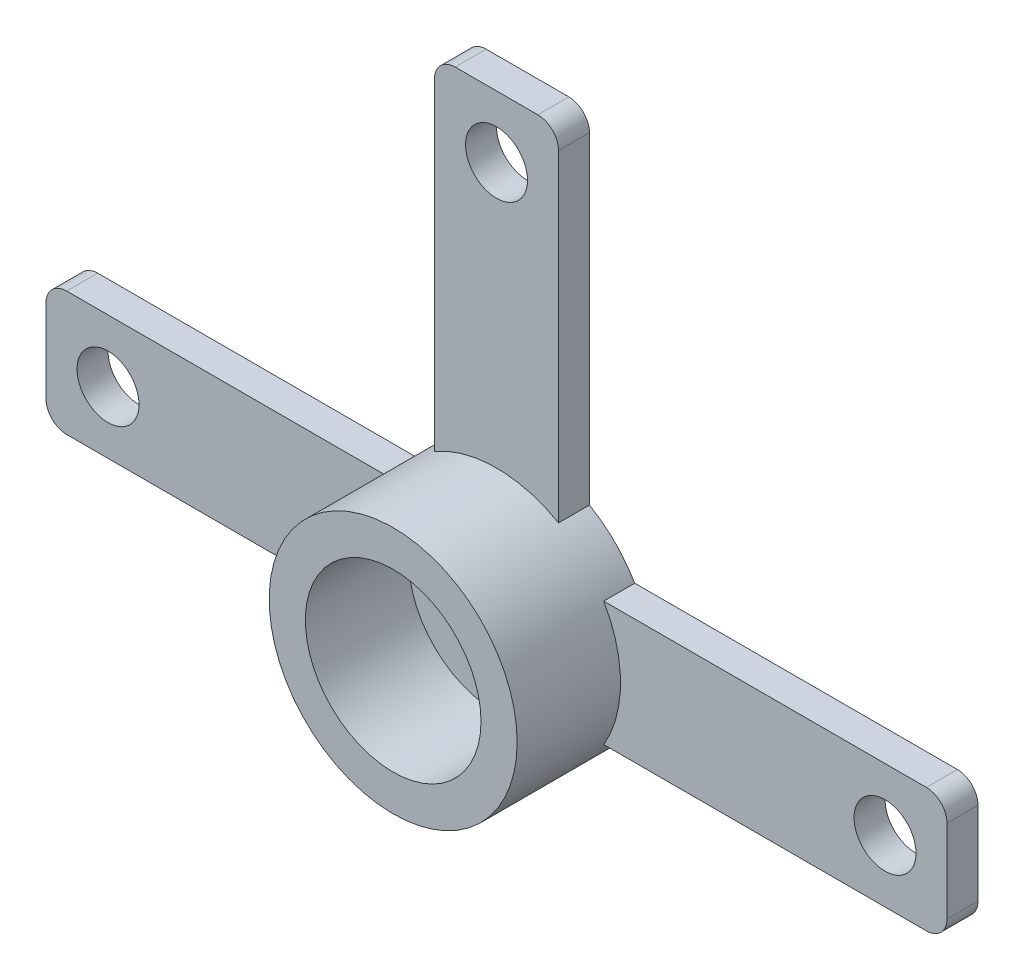
ISO-10303-21;
HEADER;
FILE_DESCRIPTION(('STEP AP214'),'2;1');
FILE_NAME('part.step','',(''),(''),'','','');
FILE_SCHEMA(('AUTOMOTIVE_DESIGN { 1 0 10303 214 1 1 1 1 }'));
ENDSEC;
DATA;
#1=APPLICATION_CONTEXT('core data for automotive mechanical design processes');
#2=APPLICATION_PROTOCOL_DEFINITION('international standard','automotive_design',2000,#1);
#3=PRODUCT_CONTEXT('',#1,'mechanical');
#4=PRODUCT('Part','Part','',(#3));
#5=PRODUCT_RELATED_PRODUCT_CATEGORY('part','',(#4));
#6=PRODUCT_DEFINITION_FORMATION('','',#4);
#7=PRODUCT_DEFINITION_CONTEXT('part definition',#1,'design');
#8=PRODUCT_DEFINITION('design','',#6,#7);
#9=PRODUCT_DEFINITION_SHAPE('','',#8);
#10=(LENGTH_UNIT() NAMED_UNIT(*) SI_UNIT(.MILLI.,.METRE.));
#11=(NAMED_UNIT(*) PLANE_ANGLE_UNIT() SI_UNIT($,.RADIAN.));
#12=(NAMED_UNIT(*) SI_UNIT($,.STERADIAN.) SOLID_ANGLE_UNIT());
#13=UNCERTAINTY_MEASURE_WITH_UNIT(LENGTH_MEASURE(1.E-05),#10,'distance_accuracy_value','');
#14=(GEOMETRIC_REPRESENTATION_CONTEXT(3) GLOBAL_UNCERTAINTY_ASSIGNED_CONTEXT((#13)) GLOBAL_UNIT_ASSIGNED_CONTEXT((#10,
#11,#12)) REPRESENTATION_CONTEXT('',''));
#15=CARTESIAN_POINT('',(0.,0.,0.));
#16=DIRECTION('',(0.,0.,1.));
#17=DIRECTION('',(1.,0.,0.));
#18=AXIS2_PLACEMENT_3D('',#15,#16,#17);
#19=CARTESIAN_POINT('',(0.,-19.,1.5));
#20=DIRECTION('',(0.,0.,1.));
#21=DIRECTION('',(1.,0.,0.));
#22=AXIS2_PLACEMENT_3D('',#19,#20,#21);
#23=PLANE('',#22);
#24=CARTESIAN_POINT('',(0.,-19.,1.5));
#25=DIRECTION('',(0.,0.,1.));
#26=DIRECTION('',(1.,0.,0.));
#27=AXIS2_PLACEMENT_3D('',#24,#25,#26);
#28=CIRCLE('',#27,6.);
#29=CARTESIAN_POINT('',(3.,-13.8038475772934,1.5));
#30=VERTEX_POINT('',#29);
#31=CARTESIAN_POINT('',(-3.,-13.8038475772934,1.5));
#32=VERTEX_POINT('',#31);
#33=EDGE_CURVE('E11',#30,#32,#28,.T.);
#34=ORIENTED_EDGE('',*,*,#33,.F.);
#35=DIRECTION('',(0.,1.,0.));
#36=VECTOR('',#35,1.);
#37=CARTESIAN_POINT('',(3.,1.79999999999996,1.5));
#38=LINE('',#37,#36);
#39=CARTESIAN_POINT('',(3.,1.79999999999996,1.5));
#40=VERTEX_POINT('',#39);
#41=EDGE_CURVE('E332',#30,#40,#38,.T.);
#42=ORIENTED_EDGE('',*,*,#41,.T.);
#43=CARTESIAN_POINT('',(2.,1.79999999999997,1.5));
#44=DIRECTION('',(0.,0.,1.));
#45=DIRECTION('',(1.,0.,0.));
#46=AXIS2_PLACEMENT_3D('',#43,#44,#45);
#47=CIRCLE('',#46,1.);
#48=CARTESIAN_POINT('',(1.99999999999999,2.79999999999997,1.5));
#49=VERTEX_POINT('',#48);
#50=EDGE_CURVE('E181',#40,#49,#47,.T.);
#51=ORIENTED_EDGE('',*,*,#50,.T.);
#52=DIRECTION('',(-1.,0.,0.));
#53=VECTOR('',#52,1.);
#54=CARTESIAN_POINT('',(1.99999999999999,2.79999999999997,1.5));
#55=LINE('',#54,#53);
#56=CARTESIAN_POINT('',(-1.99999999999999,2.79999999999997,1.5));
#57=VERTEX_POINT('',#56);
#58=EDGE_CURVE('E175',#49,#57,#55,.T.);
#59=ORIENTED_EDGE('',*,*,#58,.T.);
#60=CARTESIAN_POINT('',(-2.,1.79999999999997,1.5));
#61=DIRECTION('',(0.,0.,1.));
#62=DIRECTION('',(-1.,0.,0.));
#63=AXIS2_PLACEMENT_3D('',#60,#61,#62);
#64=CIRCLE('',#63,1.);
#65=CARTESIAN_POINT('',(-3.,1.79999999999996,1.5));
#66=VERTEX_POINT('',#65);
#67=EDGE_CURVE('E179',#57,#66,#64,.T.);
#68=ORIENTED_EDGE('',*,*,#67,.T.);
#69=DIRECTION('',(0.,-1.,0.));
#70=VECTOR('',#69,1.);
#71=CARTESIAN_POINT('',(-3.,1.79999999999996,1.5));
#72=LINE('',#71,#70);
#73=EDGE_CURVE('E61',#66,#32,#72,.T.);
#74=ORIENTED_EDGE('',*,*,#73,.T.);
#75=EDGE_LOOP('',(#34,#42,#51,#59,#68,#74));
#76=FACE_BOUND('',#75,.T.);
#77=CARTESIAN_POINT('',(0.,-0.20000000000003,1.5));
#78=DIRECTION('',(0.,0.,1.));
#79=DIRECTION('',(1.,0.,0.));
#80=AXIS2_PLACEMENT_3D('',#77,#78,#79);
#81=CIRCLE('',#80,1.5);
#82=CARTESIAN_POINT('',(1.5,-0.20000000000003,1.5));
#83=VERTEX_POINT('',#82);
#84=EDGE_CURVE('E289',#83,#83,#81,.T.);
#85=ORIENTED_EDGE('',*,*,#84,.F.);
#86=EDGE_LOOP('',(#85));
#87=FACE_BOUND('',#86,.T.);
#88=ADVANCED_FACE('F41',(#76,#87),#23,.T.);
#89=CARTESIAN_POINT('',(-5.18842774847861,-15.9866600757935,1.5));
#90=VERTEX_POINT('',#89);
#91=CARTESIAN_POINT('',(-5.19615242270666,-22.,1.5));
#92=VERTEX_POINT('',#91);
#93=EDGE_CURVE('E51',#90,#92,#28,.T.);
#94=ORIENTED_EDGE('',*,*,#93,.F.);
#95=DIRECTION('',(-1.,0.,0.));
#96=VECTOR('',#95,1.);
#97=CARTESIAN_POINT('',(-5.18842774847861,-15.9866600757935,1.5));
#98=LINE('',#97,#96);
#99=CARTESIAN_POINT('',(-20.8,-15.9866600757935,1.5));
#100=VERTEX_POINT('',#99);
#101=EDGE_CURVE('E234',#90,#100,#98,.T.);
#102=ORIENTED_EDGE('',*,*,#101,.T.);
#103=CARTESIAN_POINT('',(-20.8,-16.9866600757935,1.5));
#104=DIRECTION('',(0.,0.,1.));
#105=DIRECTION('',(1.,0.,0.));
#106=AXIS2_PLACEMENT_3D('',#103,#104,#105);
#107=CIRCLE('',#106,1.);
#108=CARTESIAN_POINT('',(-21.8,-16.9866600757935,1.5));
#109=VERTEX_POINT('',#108);
#110=EDGE_CURVE('E313',#100,#109,#107,.T.);
#111=ORIENTED_EDGE('',*,*,#110,.T.);
#112=DIRECTION('',(0.,-1.,0.));
#113=VECTOR('',#112,1.);
#114=CARTESIAN_POINT('',(-21.8,-16.9866600757935,1.5));
#115=LINE('',#114,#113);
#116=CARTESIAN_POINT('',(-21.8,-21.,1.5));
#117=VERTEX_POINT('',#116);
#118=EDGE_CURVE('E315',#109,#117,#115,.T.);
#119=ORIENTED_EDGE('',*,*,#118,.T.);
#120=CARTESIAN_POINT('',(-20.8,-21.,1.5));
#121=DIRECTION('',(0.,0.,1.));
#122=DIRECTION('',(1.,0.,0.));
#123=AXIS2_PLACEMENT_3D('',#120,#121,#122);
#124=CIRCLE('',#123,1.);
#125=CARTESIAN_POINT('',(-20.8,-22.,1.5));
#126=VERTEX_POINT('',#125);
#127=EDGE_CURVE('E317',#117,#126,#124,.T.);
#128=ORIENTED_EDGE('',*,*,#127,.T.);
#129=DIRECTION('',(1.,0.,0.));
#130=VECTOR('',#129,1.);
#131=CARTESIAN_POINT('',(-20.8,-22.,1.5));
#132=LINE('',#131,#130);
#133=EDGE_CURVE('E319',#126,#92,#132,.T.);
#134=ORIENTED_EDGE('',*,*,#133,.T.);
#135=EDGE_LOOP('',(#94,#102,#111,#119,#128,#134));
#136=FACE_BOUND('',#135,.T.);
#137=CARTESIAN_POINT('',(-18.8,-18.9999999999988,1.5));
#138=DIRECTION('',(0.,0.,1.));
#139=DIRECTION('',(1.,0.,0.));
#140=AXIS2_PLACEMENT_3D('',#137,#138,#139);
#141=CIRCLE('',#140,1.5);
#142=CARTESIAN_POINT('',(-17.3,-18.9999999999988,1.5));
#143=VERTEX_POINT('',#142);
#144=EDGE_CURVE('E302',#143,#143,#141,.T.);
#145=ORIENTED_EDGE('',*,*,#144,.F.);
#146=EDGE_LOOP('',(#145));
#147=FACE_BOUND('',#146,.T.);
#148=ADVANCED_FACE('F364',(#136,#147),#23,.T.);
#149=CARTESIAN_POINT('',(0.,-19.,1.5));
#150=DIRECTION('',(0.,0.,1.));
#151=DIRECTION('',(1.,0.,0.));
#152=AXIS2_PLACEMENT_3D('',#149,#150,#151);
#153=CIRCLE('',#152,2.66);
#154=CARTESIAN_POINT('',(2.66,-19.,1.5));
#155=VERTEX_POINT('',#154);
#156=EDGE_CURVE('E203',#155,#155,#153,.T.);
#157=ORIENTED_EDGE('',*,*,#156,.F.);
#158=EDGE_LOOP('',(#157));
#159=FACE_BOUND('',#158,.T.);
#160=CARTESIAN_POINT('',(0.,-19.,1.5));
#161=DIRECTION('',(0.,0.,1.));
#162=DIRECTION('',(1.,0.,0.));
#163=AXIS2_PLACEMENT_3D('',#160,#161,#162);
#164=CIRCLE('',#163,4.25);
#165=CARTESIAN_POINT('',(4.25,-19.,1.5));
#166=VERTEX_POINT('',#165);
#167=EDGE_CURVE('E481',#166,#166,#164,.T.);
#168=ORIENTED_EDGE('',*,*,#167,.T.);
#169=EDGE_LOOP('',(#168));
#170=FACE_BOUND('',#169,.T.);
#171=ADVANCED_FACE('F371',(#159,#170),#23,.T.);
#172=CARTESIAN_POINT('',(5.19615242270666,-22.,1.5));
#173=VERTEX_POINT('',#172);
#174=CARTESIAN_POINT('',(5.18842774847861,-15.9866600757935,1.5));
#175=VERTEX_POINT('',#174);
#176=EDGE_CURVE('E53',#173,#175,#28,.T.);
#177=ORIENTED_EDGE('',*,*,#176,.F.);
#178=DIRECTION('',(1.,0.,0.));
#179=VECTOR('',#178,1.);
#180=CARTESIAN_POINT('',(20.8,-22.,1.5));
#181=LINE('',#180,#179);
#182=CARTESIAN_POINT('',(20.8,-22.,1.5));
#183=VERTEX_POINT('',#182);
#184=EDGE_CURVE('E321',#173,#183,#181,.T.);
#185=ORIENTED_EDGE('',*,*,#184,.T.);
#186=CARTESIAN_POINT('',(20.8,-21.,1.5));
#187=DIRECTION('',(0.,0.,1.));
#188=DIRECTION('',(-1.,0.,0.));
#189=AXIS2_PLACEMENT_3D('',#186,#187,#188);
#190=CIRCLE('',#189,1.);
#191=CARTESIAN_POINT('',(21.8,-21.,1.5));
#192=VERTEX_POINT('',#191);
#193=EDGE_CURVE('E323',#183,#192,#190,.T.);
#194=ORIENTED_EDGE('',*,*,#193,.T.);
#195=DIRECTION('',(0.,1.,0.));
#196=VECTOR('',#195,1.);
#197=CARTESIAN_POINT('',(21.8,-16.9866600757935,1.5));
#198=LINE('',#197,#196);
#199=CARTESIAN_POINT('',(21.8,-16.9866600757935,1.5));
#200=VERTEX_POINT('',#199);
#201=EDGE_CURVE('E325',#192,#200,#198,.T.);
#202=ORIENTED_EDGE('',*,*,#201,.T.);
#203=CARTESIAN_POINT('',(20.8,-16.9866600757935,1.5));
#204=DIRECTION('',(0.,0.,1.));
#205=DIRECTION('',(1.,0.,0.));
#206=AXIS2_PLACEMENT_3D('',#203,#204,#205);
#207=CIRCLE('',#206,1.);
#208=CARTESIAN_POINT('',(20.8,-15.9866600757935,1.5));
#209=VERTEX_POINT('',#208);
#210=EDGE_CURVE('E327',#200,#209,#207,.T.);
#211=ORIENTED_EDGE('',*,*,#210,.T.);
#212=DIRECTION('',(-1.,0.,0.));
#213=VECTOR('',#212,1.);
#214=CARTESIAN_POINT('',(5.18842774847861,-15.9866600757935,1.5));
#215=LINE('',#214,#213);
#216=EDGE_CURVE('E329',#209,#175,#215,.T.);
#217=ORIENTED_EDGE('',*,*,#216,.T.);
#218=EDGE_LOOP('',(#177,#185,#194,#202,#211,#217));
#219=FACE_BOUND('',#218,.T.);
#220=CARTESIAN_POINT('',(18.8,-18.9999999999987,1.5));
#221=DIRECTION('',(0.,0.,1.));
#222=DIRECTION('',(1.,0.,0.));
#223=AXIS2_PLACEMENT_3D('',#220,#221,#222);
#224=CIRCLE('',#223,1.5);
#225=CARTESIAN_POINT('',(20.3,-18.9999999999987,1.5));
#226=VERTEX_POINT('',#225);
#227=EDGE_CURVE('E296',#226,#226,#224,.T.);
#228=ORIENTED_EDGE('',*,*,#227,.F.);
#229=EDGE_LOOP('',(#228));
#230=FACE_BOUND('',#229,.T.);
#231=ADVANCED_FACE('F366',(#219,#230),#23,.T.);
#232=CARTESIAN_POINT('',(0.,-19.,0.));
#233=DIRECTION('',(0.,0.,1.));
#234=DIRECTION('',(1.,0.,0.));
#235=AXIS2_PLACEMENT_3D('',#232,#233,#234);
#236=PLANE('',#235);
#237=CARTESIAN_POINT('',(0.,-19.,0.));
#238=DIRECTION('',(0.,0.,1.));
#239=DIRECTION('',(1.,0.,0.));
#240=AXIS2_PLACEMENT_3D('',#237,#238,#239);
#241=CIRCLE('',#240,6.);
#242=CARTESIAN_POINT('',(-3.,-13.8038475772934,0.));
#243=VERTEX_POINT('',#242);
#244=CARTESIAN_POINT('',(-5.18842774847861,-15.9866600757935,0.));
#245=VERTEX_POINT('',#244);
#246=EDGE_CURVE('E199',#243,#245,#241,.T.);
#247=ORIENTED_EDGE('',*,*,#246,.F.);
#248=DIRECTION('',(0.,-1.,0.));
#249=VECTOR('',#248,1.);
#250=CARTESIAN_POINT('',(-3.,1.79999999999996,0.));
#251=LINE('',#250,#249);
#252=CARTESIAN_POINT('',(-3.,1.79999999999996,0.));
#253=VERTEX_POINT('',#252);
#254=EDGE_CURVE('E127',#253,#243,#251,.T.);
#255=ORIENTED_EDGE('',*,*,#254,.F.);
#256=CARTESIAN_POINT('',(-2.,1.79999999999997,0.));
#257=DIRECTION('',(0.,0.,1.));
#258=DIRECTION('',(-1.,0.,0.));
#259=AXIS2_PLACEMENT_3D('',#256,#257,#258);
#260=CIRCLE('',#259,1.);
#261=CARTESIAN_POINT('',(-1.99999999999999,2.79999999999997,0.));
#262=VERTEX_POINT('',#261);
#263=EDGE_CURVE('E121',#262,#253,#260,.T.);
#264=ORIENTED_EDGE('',*,*,#263,.F.);
#265=DIRECTION('',(-1.,0.,0.));
#266=VECTOR('',#265,1.);
#267=CARTESIAN_POINT('',(1.99999999999999,2.79999999999997,0.));
#268=LINE('',#267,#266);
#269=CARTESIAN_POINT('',(1.99999999999999,2.79999999999997,0.));
#270=VERTEX_POINT('',#269);
#271=EDGE_CURVE('E189',#270,#262,#268,.T.);
#272=ORIENTED_EDGE('',*,*,#271,.F.);
#273=CARTESIAN_POINT('',(2.,1.79999999999997,0.));
#274=DIRECTION('',(0.,0.,1.));
#275=DIRECTION('',(1.,0.,0.));
#276=AXIS2_PLACEMENT_3D('',#273,#274,#275);
#277=CIRCLE('',#276,1.);
#278=CARTESIAN_POINT('',(3.,1.79999999999996,0.));
#279=VERTEX_POINT('',#278);
#280=EDGE_CURVE('E229',#279,#270,#277,.T.);
#281=ORIENTED_EDGE('',*,*,#280,.F.);
#282=DIRECTION('',(0.,1.,0.));
#283=VECTOR('',#282,1.);
#284=CARTESIAN_POINT('',(3.,1.79999999999996,0.));
#285=LINE('',#284,#283);
#286=CARTESIAN_POINT('',(3.,-13.8038475772934,0.));
#287=VERTEX_POINT('',#286);
#288=EDGE_CURVE('E227',#287,#279,#285,.T.);
#289=ORIENTED_EDGE('',*,*,#288,.F.);
#290=CARTESIAN_POINT('',(0.,-19.,0.));
#291=DIRECTION('',(0.,0.,1.));
#292=DIRECTION('',(1.,0.,0.));
#293=AXIS2_PLACEMENT_3D('',#290,#291,#292);
#294=CIRCLE('',#293,6.);
#295=CARTESIAN_POINT('',(5.18842774847861,-15.9866600757935,0.));
#296=VERTEX_POINT('',#295);
#297=EDGE_CURVE('E225',#296,#287,#294,.T.);
#298=ORIENTED_EDGE('',*,*,#297,.F.);
#299=DIRECTION('',(-1.,0.,0.));
#300=VECTOR('',#299,1.);
#301=CARTESIAN_POINT('',(5.18842774847861,-15.9866600757935,0.));
#302=LINE('',#301,#300);
#303=CARTESIAN_POINT('',(20.8,-15.9866600757935,0.));
#304=VERTEX_POINT('',#303);
#305=EDGE_CURVE('E223',#304,#296,#302,.T.);
#306=ORIENTED_EDGE('',*,*,#305,.F.);
#307=CARTESIAN_POINT('',(20.8,-16.9866600757935,0.));
#308=DIRECTION('',(0.,0.,1.));
#309=DIRECTION('',(1.,0.,0.));
#310=AXIS2_PLACEMENT_3D('',#307,#308,#309);
#311=CIRCLE('',#310,1.);
#312=CARTESIAN_POINT('',(21.8,-16.9866600757935,0.));
#313=VERTEX_POINT('',#312);
#314=EDGE_CURVE('E221',#313,#304,#311,.T.);
#315=ORIENTED_EDGE('',*,*,#314,.F.);
#316=DIRECTION('',(0.,1.,0.));
#317=VECTOR('',#316,1.);
#318=CARTESIAN_POINT('',(21.8,-16.9866600757935,0.));
#319=LINE('',#318,#317);
#320=CARTESIAN_POINT('',(21.8,-21.,0.));
#321=VERTEX_POINT('',#320);
#322=EDGE_CURVE('E219',#321,#313,#319,.T.);
#323=ORIENTED_EDGE('',*,*,#322,.F.);
#324=CARTESIAN_POINT('',(20.8,-21.,0.));
#325=DIRECTION('',(0.,0.,1.));
#326=DIRECTION('',(-1.,0.,0.));
#327=AXIS2_PLACEMENT_3D('',#324,#325,#326);
#328=CIRCLE('',#327,1.);
#329=CARTESIAN_POINT('',(20.8,-22.,0.));
#330=VERTEX_POINT('',#329);
#331=EDGE_CURVE('E217',#330,#321,#328,.T.);
#332=ORIENTED_EDGE('',*,*,#331,.F.);
#333=DIRECTION('',(1.,0.,0.));
#334=VECTOR('',#333,1.);
#335=CARTESIAN_POINT('',(20.8,-22.,0.));
#336=LINE('',#335,#334);
#337=CARTESIAN_POINT('',(5.19615242270666,-22.,0.));
#338=VERTEX_POINT('',#337);
#339=EDGE_CURVE('E215',#338,#330,#336,.T.);
#340=ORIENTED_EDGE('',*,*,#339,.F.);
#341=CARTESIAN_POINT('',(0.,-19.,0.));
#342=DIRECTION('',(0.,0.,1.));
#343=DIRECTION('',(1.,0.,0.));
#344=AXIS2_PLACEMENT_3D('',#341,#342,#343);
#345=CIRCLE('',#344,6.);
#346=CARTESIAN_POINT('',(-5.19615242270666,-22.,0.));
#347=VERTEX_POINT('',#346);
#348=EDGE_CURVE('E213',#347,#338,#345,.T.);
#349=ORIENTED_EDGE('',*,*,#348,.F.);
#350=DIRECTION('',(1.,0.,0.));
#351=VECTOR('',#350,1.);
#352=CARTESIAN_POINT('',(-20.8,-22.,0.));
#353=LINE('',#352,#351);
#354=CARTESIAN_POINT('',(-20.8,-22.,0.));
#355=VERTEX_POINT('',#354);
#356=EDGE_CURVE('E211',#355,#347,#353,.T.);
#357=ORIENTED_EDGE('',*,*,#356,.F.);
#358=CARTESIAN_POINT('',(-20.8,-21.,0.));
#359=DIRECTION('',(0.,0.,1.));
#360=DIRECTION('',(1.,0.,0.));
#361=AXIS2_PLACEMENT_3D('',#358,#359,#360);
#362=CIRCLE('',#361,1.);
#363=CARTESIAN_POINT('',(-21.8,-21.,0.));
#364=VERTEX_POINT('',#363);
#365=EDGE_CURVE('E209',#364,#355,#362,.T.);
#366=ORIENTED_EDGE('',*,*,#365,.F.);
#367=DIRECTION('',(0.,-1.,0.));
#368=VECTOR('',#367,1.);
#369=CARTESIAN_POINT('',(-21.8,-16.9866600757935,0.));
#370=LINE('',#369,#368);
#371=CARTESIAN_POINT('',(-21.8,-16.9866600757935,0.));
#372=VERTEX_POINT('',#371);
#373=EDGE_CURVE('E207',#372,#364,#370,.T.);
#374=ORIENTED_EDGE('',*,*,#373,.F.);
#375=CARTESIAN_POINT('',(-20.8,-16.9866600757935,0.));
#376=DIRECTION('',(0.,0.,1.));
#377=DIRECTION('',(1.,0.,0.));
#378=AXIS2_PLACEMENT_3D('',#375,#376,#377);
#379=CIRCLE('',#378,1.);
#380=CARTESIAN_POINT('',(-20.8,-15.9866600757935,0.));
#381=VERTEX_POINT('',#380);
#382=EDGE_CURVE('E205',#381,#372,#379,.T.);
#383=ORIENTED_EDGE('',*,*,#382,.F.);
#384=DIRECTION('',(-1.,0.,0.));
#385=VECTOR('',#384,1.);
#386=CARTESIAN_POINT('',(-5.18842774847861,-15.9866600757935,0.));
#387=LINE('',#386,#385);
#388=EDGE_CURVE('E202',#245,#381,#387,.T.);
#389=ORIENTED_EDGE('',*,*,#388,.F.);
#390=EDGE_LOOP('',(#247,#255,#264,#272,#281,#289,#298,#306,#315,#323,#332,#340,#349,#357,#366,
#374,#383,#389));
#391=FACE_BOUND('',#390,.T.);
#392=CARTESIAN_POINT('',(0.,-19.,0.));
#393=DIRECTION('',(0.,0.,1.));
#394=DIRECTION('',(1.,0.,0.));
#395=AXIS2_PLACEMENT_3D('',#392,#393,#394);
#396=CIRCLE('',#395,2.66);
#397=CARTESIAN_POINT('',(2.66,-19.,0.));
#398=VERTEX_POINT('',#397);
#399=EDGE_CURVE('E305',#398,#398,#396,.T.);
#400=ORIENTED_EDGE('',*,*,#399,.T.);
#401=EDGE_LOOP('',(#400));
#402=FACE_BOUND('',#401,.T.);
#403=CARTESIAN_POINT('',(-18.8,-18.9999999999988,0.));
#404=DIRECTION('',(0.,0.,1.));
#405=DIRECTION('',(1.,0.,0.));
#406=AXIS2_PLACEMENT_3D('',#403,#404,#405);
#407=CIRCLE('',#406,1.5);
#408=CARTESIAN_POINT('',(-17.3,-18.9999999999988,0.));
#409=VERTEX_POINT('',#408);
#410=EDGE_CURVE('E299',#409,#409,#407,.T.);
#411=ORIENTED_EDGE('',*,*,#410,.T.);
#412=EDGE_LOOP('',(#411));
#413=FACE_BOUND('',#412,.T.);
#414=CARTESIAN_POINT('',(18.8,-18.9999999999987,0.));
#415=DIRECTION('',(0.,0.,1.));
#416=DIRECTION('',(1.,0.,0.));
#417=AXIS2_PLACEMENT_3D('',#414,#415,#416);
#418=CIRCLE('',#417,1.5);
#419=CARTESIAN_POINT('',(20.3,-18.9999999999987,0.));
#420=VERTEX_POINT('',#419);
#421=EDGE_CURVE('E292',#420,#420,#418,.T.);
#422=ORIENTED_EDGE('',*,*,#421,.T.);
#423=EDGE_LOOP('',(#422));
#424=FACE_BOUND('',#423,.T.);
#425=CARTESIAN_POINT('',(0.,-0.20000000000003,0.));
#426=DIRECTION('',(0.,0.,1.));
#427=DIRECTION('',(1.,0.,0.));
#428=AXIS2_PLACEMENT_3D('',#425,#426,#427);
#429=CIRCLE('',#428,1.5);
#430=CARTESIAN_POINT('',(1.5,-0.20000000000003,0.));
#431=VERTEX_POINT('',#430);
#432=EDGE_CURVE('E293',#431,#431,#429,.T.);
#433=ORIENTED_EDGE('',*,*,#432,.T.);
#434=EDGE_LOOP('',(#433));
#435=FACE_BOUND('',#434,.T.);
#436=ADVANCED_FACE('F344',(#391,#402,#413,#424,#435),#236,.F.);
#437=CARTESIAN_POINT('',(-5.18842774847861,-15.9866600757935,1.5));
#438=DIRECTION('',(0.,-1.,0.));
#439=DIRECTION('',(1.,0.,0.));
#440=AXIS2_PLACEMENT_3D('',#437,#438,#439);
#441=PLANE('',#440);
#442=ORIENTED_EDGE('',*,*,#388,.T.);
#443=DIRECTION('',(0.,0.,-1.));
#444=VECTOR('',#443,1.);
#445=CARTESIAN_POINT('',(-20.8,-15.9866600757935,1.5));
#446=LINE('',#445,#444);
#447=EDGE_CURVE('E273',#100,#381,#446,.T.);
#448=ORIENTED_EDGE('',*,*,#447,.F.);
#449=ORIENTED_EDGE('',*,*,#101,.F.);
#450=DIRECTION('',(0.,0.,-1.));
#451=VECTOR('',#450,1.);
#452=CARTESIAN_POINT('',(-5.18842774847861,-15.9866600757935,1.5));
#453=LINE('',#452,#451);
#454=EDGE_CURVE('E45',#90,#245,#453,.T.);
#455=ORIENTED_EDGE('',*,*,#454,.T.);
#456=EDGE_LOOP('',(#442,#448,#449,#455));
#457=FACE_BOUND('',#456,.T.);
#458=ADVANCED_FACE('F43',(#457),#441,.F.);
#459=CARTESIAN_POINT('',(-20.8,-16.9866600757935,1.5));
#460=DIRECTION('',(0.,0.,-1.));
#461=DIRECTION('',(-1.,0.,0.));
#462=AXIS2_PLACEMENT_3D('',#459,#460,#461);
#463=CYLINDRICAL_SURFACE('',#462,1.);
#464=ORIENTED_EDGE('',*,*,#382,.T.);
#465=DIRECTION('',(0.,0.,-1.));
#466=VECTOR('',#465,1.);
#467=CARTESIAN_POINT('',(-21.8,-16.9866600757935,1.5));
#468=LINE('',#467,#466);
#469=EDGE_CURVE('E271',#109,#372,#468,.T.);
#470=ORIENTED_EDGE('',*,*,#469,.F.);
#471=ORIENTED_EDGE('',*,*,#110,.F.);
#472=ORIENTED_EDGE('',*,*,#447,.T.);
#473=EDGE_LOOP('',(#464,#470,#471,#472));
#474=FACE_BOUND('',#473,.T.);
#475=ADVANCED_FACE('F555',(#474),#463,.T.);
#476=CARTESIAN_POINT('',(-21.8,-16.9866600757935,1.5));
#477=DIRECTION('',(1.,0.,0.));
#478=DIRECTION('',(0.,0.,-1.));
#479=AXIS2_PLACEMENT_3D('',#476,#477,#478);
#480=PLANE('',#479);
#481=ORIENTED_EDGE('',*,*,#373,.T.);
#482=DIRECTION('',(0.,0.,-1.));
#483=VECTOR('',#482,1.);
#484=CARTESIAN_POINT('',(-21.8,-21.,1.5));
#485=LINE('',#484,#483);
#486=EDGE_CURVE('E268',#117,#364,#485,.T.);
#487=ORIENTED_EDGE('',*,*,#486,.F.);
#488=ORIENTED_EDGE('',*,*,#118,.F.);
#489=ORIENTED_EDGE('',*,*,#469,.T.);
#490=EDGE_LOOP('',(#481,#487,#488,#489));
#491=FACE_BOUND('',#490,.T.);
#492=ADVANCED_FACE('F552',(#491),#480,.F.);
#493=CARTESIAN_POINT('',(-20.8,-21.,1.5));
#494=DIRECTION('',(0.,0.,-1.));
#495=DIRECTION('',(-1.,0.,0.));
#496=AXIS2_PLACEMENT_3D('',#493,#494,#495);
#497=CYLINDRICAL_SURFACE('',#496,1.);
#498=ORIENTED_EDGE('',*,*,#365,.T.);
#499=DIRECTION('',(0.,0.,-1.));
#500=VECTOR('',#499,1.);
#501=CARTESIAN_POINT('',(-20.8,-22.,1.5));
#502=LINE('',#501,#500);
#503=EDGE_CURVE('E265',#126,#355,#502,.T.);
#504=ORIENTED_EDGE('',*,*,#503,.F.);
#505=ORIENTED_EDGE('',*,*,#127,.F.);
#506=ORIENTED_EDGE('',*,*,#486,.T.);
#507=EDGE_LOOP('',(#498,#504,#505,#506));
#508=FACE_BOUND('',#507,.T.);
#509=ADVANCED_FACE('F548',(#508),#497,.T.);
#510=CARTESIAN_POINT('',(-20.8,-22.,1.5));
#511=DIRECTION('',(0.,1.,0.));
#512=DIRECTION('',(0.,0.,1.));
#513=AXIS2_PLACEMENT_3D('',#510,#511,#512);
#514=PLANE('',#513);
#515=ORIENTED_EDGE('',*,*,#356,.T.);
#516=DIRECTION('',(0.,0.,-1.));
#517=VECTOR('',#516,1.);
#518=CARTESIAN_POINT('',(-5.19615242270666,-22.,1.5));
#519=LINE('',#518,#517);
#520=EDGE_CURVE('E262',#92,#347,#519,.T.);
#521=ORIENTED_EDGE('',*,*,#520,.F.);
#522=ORIENTED_EDGE('',*,*,#133,.F.);
#523=ORIENTED_EDGE('',*,*,#503,.T.);
#524=EDGE_LOOP('',(#515,#521,#522,#523));
#525=FACE_BOUND('',#524,.T.);
#526=ADVANCED_FACE('F545',(#525),#514,.F.);
#527=CARTESIAN_POINT('',(20.8,-22.,1.5));
#528=DIRECTION('',(0.,1.,0.));
#529=DIRECTION('',(0.,0.,1.));
#530=AXIS2_PLACEMENT_3D('',#527,#528,#529);
#531=PLANE('',#530);
#532=ORIENTED_EDGE('',*,*,#339,.T.);
#533=DIRECTION('',(0.,0.,-1.));
#534=VECTOR('',#533,1.);
#535=CARTESIAN_POINT('',(20.8,-22.,1.5));
#536=LINE('',#535,#534);
#537=EDGE_CURVE('E256',#183,#330,#536,.T.);
#538=ORIENTED_EDGE('',*,*,#537,.F.);
#539=ORIENTED_EDGE('',*,*,#184,.F.);
#540=DIRECTION('',(0.,0.,-1.));
#541=VECTOR('',#540,1.);
#542=CARTESIAN_POINT('',(5.19615242270666,-22.,1.5));
#543=LINE('',#542,#541);
#544=EDGE_CURVE('E259',#173,#338,#543,.T.);
#545=ORIENTED_EDGE('',*,*,#544,.T.);
#546=EDGE_LOOP('',(#532,#538,#539,#545));
#547=FACE_BOUND('',#546,.T.);
#548=ADVANCED_FACE('F487',(#547),#531,.F.);
#549=CARTESIAN_POINT('',(20.8,-21.,1.5));
#550=DIRECTION('',(0.,0.,-1.));
#551=DIRECTION('',(-1.,0.,0.));
#552=AXIS2_PLACEMENT_3D('',#549,#550,#551);
#553=CYLINDRICAL_SURFACE('',#552,1.);
#554=ORIENTED_EDGE('',*,*,#331,.T.);
#555=DIRECTION('',(0.,0.,-1.));
#556=VECTOR('',#555,1.);
#557=CARTESIAN_POINT('',(21.8,-21.,1.5));
#558=LINE('',#557,#556);
#559=EDGE_CURVE('E253',#192,#321,#558,.T.);
#560=ORIENTED_EDGE('',*,*,#559,.F.);
#561=ORIENTED_EDGE('',*,*,#193,.F.);
#562=ORIENTED_EDGE('',*,*,#537,.T.);
#563=EDGE_LOOP('',(#554,#560,#561,#562));
#564=FACE_BOUND('',#563,.T.);
#565=ADVANCED_FACE('F539',(#564),#553,.T.);
#566=CARTESIAN_POINT('',(21.8,-16.9866600757935,1.5));
#567=DIRECTION('',(-1.,0.,0.));
#568=DIRECTION('',(0.,0.,1.));
#569=AXIS2_PLACEMENT_3D('',#566,#567,#568);
#570=PLANE('',#569);
#571=ORIENTED_EDGE('',*,*,#322,.T.);
#572=DIRECTION('',(0.,0.,-1.));
#573=VECTOR('',#572,1.);
#574=CARTESIAN_POINT('',(21.8,-16.9866600757935,1.5));
#575=LINE('',#574,#573);
#576=EDGE_CURVE('E250',#200,#313,#575,.T.);
#577=ORIENTED_EDGE('',*,*,#576,.F.);
#578=ORIENTED_EDGE('',*,*,#201,.F.);
#579=ORIENTED_EDGE('',*,*,#559,.T.);
#580=EDGE_LOOP('',(#571,#577,#578,#579));
#581=FACE_BOUND('',#580,.T.);
#582=ADVANCED_FACE('F535',(#581),#570,.F.);
#583=CARTESIAN_POINT('',(20.8,-16.9866600757935,1.5));
#584=DIRECTION('',(0.,0.,-1.));
#585=DIRECTION('',(-1.,0.,0.));
#586=AXIS2_PLACEMENT_3D('',#583,#584,#585);
#587=CYLINDRICAL_SURFACE('',#586,1.);
#588=ORIENTED_EDGE('',*,*,#314,.T.);
#589=DIRECTION('',(0.,0.,-1.));
#590=VECTOR('',#589,1.);
#591=CARTESIAN_POINT('',(20.8,-15.9866600757935,1.5));
#592=LINE('',#591,#590);
#593=EDGE_CURVE('E247',#209,#304,#592,.T.);
#594=ORIENTED_EDGE('',*,*,#593,.F.);
#595=ORIENTED_EDGE('',*,*,#210,.F.);
#596=ORIENTED_EDGE('',*,*,#576,.T.);
#597=EDGE_LOOP('',(#588,#594,#595,#596));
#598=FACE_BOUND('',#597,.T.);
#599=ADVANCED_FACE('F531',(#598),#587,.T.);
#600=CARTESIAN_POINT('',(5.18842774847861,-15.9866600757935,1.5));
#601=DIRECTION('',(0.,-1.,0.));
#602=DIRECTION('',(0.,0.,-1.));
#603=AXIS2_PLACEMENT_3D('',#600,#601,#602);
#604=PLANE('',#603);
#605=ORIENTED_EDGE('',*,*,#305,.T.);
#606=DIRECTION('',(0.,0.,-1.));
#607=VECTOR('',#606,1.);
#608=CARTESIAN_POINT('',(5.18842774847861,-15.9866600757935,1.5));
#609=LINE('',#608,#607);
#610=EDGE_CURVE('E244',#175,#296,#609,.T.);
#611=ORIENTED_EDGE('',*,*,#610,.F.);
#612=ORIENTED_EDGE('',*,*,#216,.F.);
#613=ORIENTED_EDGE('',*,*,#593,.T.);
#614=EDGE_LOOP('',(#605,#611,#612,#613));
#615=FACE_BOUND('',#614,.T.);
#616=ADVANCED_FACE('F448',(#615),#604,.F.);
#617=CARTESIAN_POINT('',(0.,-19.,1.5));
#618=DIRECTION('',(0.,0.,-1.));
#619=DIRECTION('',(-1.,0.,0.));
#620=AXIS2_PLACEMENT_3D('',#617,#618,#619);
#621=CYLINDRICAL_SURFACE('',#620,6.);
#622=ORIENTED_EDGE('',*,*,#297,.T.);
#623=DIRECTION('',(0.,0.,-1.));
#624=VECTOR('',#623,1.);
#625=CARTESIAN_POINT('',(3.,-13.8038475772934,1.5));
#626=LINE('',#625,#624);
#627=EDGE_CURVE('E241',#30,#287,#626,.T.);
#628=ORIENTED_EDGE('',*,*,#627,.F.);
#629=ORIENTED_EDGE('',*,*,#33,.T.);
#630=DIRECTION('',(0.,0.,-1.));
#631=VECTOR('',#630,1.);
#632=CARTESIAN_POINT('',(-3.,-13.8038475772934,1.5));
#633=LINE('',#632,#631);
#634=EDGE_CURVE('E195',#32,#243,#633,.T.);
#635=ORIENTED_EDGE('',*,*,#634,.T.);
#636=ORIENTED_EDGE('',*,*,#246,.T.);
#637=ORIENTED_EDGE('',*,*,#454,.F.);
#638=ORIENTED_EDGE('',*,*,#93,.T.);
#639=ORIENTED_EDGE('',*,*,#520,.T.);
#640=ORIENTED_EDGE('',*,*,#348,.T.);
#641=ORIENTED_EDGE('',*,*,#544,.F.);
#642=ORIENTED_EDGE('',*,*,#176,.T.);
#643=ORIENTED_EDGE('',*,*,#610,.T.);
#644=EDGE_LOOP('',(#622,#628,#629,#635,#636,#637,#638,#639,#640,#641,#642,#643));
#645=FACE_BOUND('',#644,.T.);
#646=CARTESIAN_POINT('',(0.,-19.,6.5));
#647=DIRECTION('',(0.,0.,1.));
#648=DIRECTION('',(1.,0.,0.));
#649=AXIS2_PLACEMENT_3D('',#646,#647,#648);
#650=CIRCLE('',#649,6.);
#651=CARTESIAN_POINT('',(6.,-19.,6.5));
#652=VERTEX_POINT('',#651);
#653=EDGE_CURVE('E287',#652,#652,#650,.T.);
#654=ORIENTED_EDGE('',*,*,#653,.F.);
#655=EDGE_LOOP('',(#654));
#656=FACE_BOUND('',#655,.T.);
#657=ADVANCED_FACE('F346',(#645,#656),#621,.T.);
#658=CARTESIAN_POINT('',(3.,1.79999999999996,1.5));
#659=DIRECTION('',(-1.,0.,0.));
#660=DIRECTION('',(0.,-1.,0.));
#661=AXIS2_PLACEMENT_3D('',#658,#659,#660);
#662=PLANE('',#661);
#663=ORIENTED_EDGE('',*,*,#288,.T.);
#664=DIRECTION('',(0.,0.,-1.));
#665=VECTOR('',#664,1.);
#666=CARTESIAN_POINT('',(3.,1.79999999999996,1.5));
#667=LINE('',#666,#665);
#668=EDGE_CURVE('E238',#40,#279,#667,.T.);
#669=ORIENTED_EDGE('',*,*,#668,.F.);
#670=ORIENTED_EDGE('',*,*,#41,.F.);
#671=ORIENTED_EDGE('',*,*,#627,.T.);
#672=EDGE_LOOP('',(#663,#669,#670,#671));
#673=FACE_BOUND('',#672,.T.);
#674=ADVANCED_FACE('F337',(#673),#662,.F.);
#675=CARTESIAN_POINT('',(2.,1.79999999999997,1.5));
#676=DIRECTION('',(0.,0.,-1.));
#677=DIRECTION('',(-1.,0.,0.));
#678=AXIS2_PLACEMENT_3D('',#675,#676,#677);
#679=CYLINDRICAL_SURFACE('',#678,1.);
#680=ORIENTED_EDGE('',*,*,#280,.T.);
#681=DIRECTION('',(0.,0.,-1.));
#682=VECTOR('',#681,1.);
#683=CARTESIAN_POINT('',(1.99999999999999,2.79999999999997,1.5));
#684=LINE('',#683,#682);
#685=EDGE_CURVE('E190',#49,#270,#684,.T.);
#686=ORIENTED_EDGE('',*,*,#685,.F.);
#687=ORIENTED_EDGE('',*,*,#50,.F.);
#688=ORIENTED_EDGE('',*,*,#668,.T.);
#689=EDGE_LOOP('',(#680,#686,#687,#688));
#690=FACE_BOUND('',#689,.T.);
#691=ADVANCED_FACE('F341',(#690),#679,.T.);
#692=CARTESIAN_POINT('',(1.99999999999999,2.79999999999997,1.5));
#693=DIRECTION('',(0.,-1.,0.));
#694=DIRECTION('',(1.,0.,0.));
#695=AXIS2_PLACEMENT_3D('',#692,#693,#694);
#696=PLANE('',#695);
#697=ORIENTED_EDGE('',*,*,#271,.T.);
#698=DIRECTION('',(0.,0.,-1.));
#699=VECTOR('',#698,1.);
#700=CARTESIAN_POINT('',(-1.99999999999999,2.79999999999997,1.5));
#701=LINE('',#700,#699);
#702=EDGE_CURVE('E186',#57,#262,#701,.T.);
#703=ORIENTED_EDGE('',*,*,#702,.F.);
#704=ORIENTED_EDGE('',*,*,#58,.F.);
#705=ORIENTED_EDGE('',*,*,#685,.T.);
#706=EDGE_LOOP('',(#697,#703,#704,#705));
#707=FACE_BOUND('',#706,.T.);
#708=ADVANCED_FACE('F187',(#707),#696,.F.);
#709=CARTESIAN_POINT('',(-2.,1.79999999999997,1.5));
#710=DIRECTION('',(0.,0.,-1.));
#711=DIRECTION('',(-1.,0.,0.));
#712=AXIS2_PLACEMENT_3D('',#709,#710,#711);
#713=CYLINDRICAL_SURFACE('',#712,1.);
#714=ORIENTED_EDGE('',*,*,#263,.T.);
#715=DIRECTION('',(0.,0.,-1.));
#716=VECTOR('',#715,1.);
#717=CARTESIAN_POINT('',(-3.,1.79999999999996,1.5));
#718=LINE('',#717,#716);
#719=EDGE_CURVE('E191',#66,#253,#718,.T.);
#720=ORIENTED_EDGE('',*,*,#719,.F.);
#721=ORIENTED_EDGE('',*,*,#67,.F.);
#722=ORIENTED_EDGE('',*,*,#702,.T.);
#723=EDGE_LOOP('',(#714,#720,#721,#722));
#724=FACE_BOUND('',#723,.T.);
#725=ADVANCED_FACE('F193',(#724),#713,.T.);
#726=CARTESIAN_POINT('',(-3.,1.79999999999996,1.5));
#727=DIRECTION('',(1.,0.,0.));
#728=DIRECTION('',(0.,1.,0.));
#729=AXIS2_PLACEMENT_3D('',#726,#727,#728);
#730=PLANE('',#729);
#731=ORIENTED_EDGE('',*,*,#254,.T.);
#732=ORIENTED_EDGE('',*,*,#634,.F.);
#733=ORIENTED_EDGE('',*,*,#73,.F.);
#734=ORIENTED_EDGE('',*,*,#719,.T.);
#735=EDGE_LOOP('',(#731,#732,#733,#734));
#736=FACE_BOUND('',#735,.T.);
#737=ADVANCED_FACE('F348',(#736),#730,.F.);
#738=CARTESIAN_POINT('',(0.,-19.,1.5));
#739=DIRECTION('',(0.,0.,-1.));
#740=DIRECTION('',(-1.,0.,0.));
#741=AXIS2_PLACEMENT_3D('',#738,#739,#740);
#742=CYLINDRICAL_SURFACE('',#741,2.66);
#743=ORIENTED_EDGE('',*,*,#156,.T.);
#744=EDGE_LOOP('',(#743));
#745=FACE_BOUND('',#744,.T.);
#746=ORIENTED_EDGE('',*,*,#399,.F.);
#747=EDGE_LOOP('',(#746));
#748=FACE_BOUND('',#747,.T.);
#749=ADVANCED_FACE('F350',(#745,#748),#742,.F.);
#750=CARTESIAN_POINT('',(-18.8,-18.9999999999988,1.5));
#751=DIRECTION('',(0.,0.,-1.));
#752=DIRECTION('',(-1.,0.,0.));
#753=AXIS2_PLACEMENT_3D('',#750,#751,#752);
#754=CYLINDRICAL_SURFACE('',#753,1.5);
#755=ORIENTED_EDGE('',*,*,#144,.T.);
#756=EDGE_LOOP('',(#755));
#757=FACE_BOUND('',#756,.T.);
#758=ORIENTED_EDGE('',*,*,#410,.F.);
#759=EDGE_LOOP('',(#758));
#760=FACE_BOUND('',#759,.T.);
#761=ADVANCED_FACE('F357',(#757,#760),#754,.F.);
#762=CARTESIAN_POINT('',(18.8,-18.9999999999987,1.5));
#763=DIRECTION('',(0.,0.,-1.));
#764=DIRECTION('',(-1.,0.,0.));
#765=AXIS2_PLACEMENT_3D('',#762,#763,#764);
#766=CYLINDRICAL_SURFACE('',#765,1.5);
#767=ORIENTED_EDGE('',*,*,#227,.T.);
#768=EDGE_LOOP('',(#767));
#769=FACE_BOUND('',#768,.T.);
#770=ORIENTED_EDGE('',*,*,#421,.F.);
#771=EDGE_LOOP('',(#770));
#772=FACE_BOUND('',#771,.T.);
#773=ADVANCED_FACE('F383',(#769,#772),#766,.F.);
#774=CARTESIAN_POINT('',(0.,-0.20000000000003,1.5));
#775=DIRECTION('',(0.,0.,-1.));
#776=DIRECTION('',(-1.,0.,0.));
#777=AXIS2_PLACEMENT_3D('',#774,#775,#776);
#778=CYLINDRICAL_SURFACE('',#777,1.5);
#779=ORIENTED_EDGE('',*,*,#84,.T.);
#780=EDGE_LOOP('',(#779));
#781=FACE_BOUND('',#780,.T.);
#782=ORIENTED_EDGE('',*,*,#432,.F.);
#783=EDGE_LOOP('',(#782));
#784=FACE_BOUND('',#783,.T.);
#785=ADVANCED_FACE('F386',(#781,#784),#778,.F.);
#786=CARTESIAN_POINT('',(0.,-19.,6.5));
#787=DIRECTION('',(0.,0.,1.));
#788=DIRECTION('',(1.,0.,0.));
#789=AXIS2_PLACEMENT_3D('',#786,#787,#788);
#790=PLANE('',#789);
#791=ORIENTED_EDGE('',*,*,#653,.T.);
#792=EDGE_LOOP('',(#791));
#793=FACE_BOUND('',#792,.T.);
#794=CARTESIAN_POINT('',(0.,-19.,6.5));
#795=DIRECTION('',(0.,0.,1.));
#796=DIRECTION('',(1.,0.,0.));
#797=AXIS2_PLACEMENT_3D('',#794,#795,#796);
#798=CIRCLE('',#797,4.25);
#799=CARTESIAN_POINT('',(4.25,-19.,6.5));
#800=VERTEX_POINT('',#799);
#801=EDGE_CURVE('E478',#800,#800,#798,.T.);
#802=ORIENTED_EDGE('',*,*,#801,.F.);
#803=EDGE_LOOP('',(#802));
#804=FACE_BOUND('',#803,.T.);
#805=ADVANCED_FACE('F393',(#793,#804),#790,.T.);
#806=CARTESIAN_POINT('',(0.,-19.,6.5));
#807=DIRECTION('',(0.,0.,-1.));
#808=DIRECTION('',(-1.,0.,0.));
#809=AXIS2_PLACEMENT_3D('',#806,#807,#808);
#810=CYLINDRICAL_SURFACE('',#809,4.25);
#811=ORIENTED_EDGE('',*,*,#801,.T.);
#812=EDGE_LOOP('',(#811));
#813=FACE_BOUND('',#812,.T.);
#814=ORIENTED_EDGE('',*,*,#167,.F.);
#815=EDGE_LOOP('',(#814));
#816=FACE_BOUND('',#815,.T.);
#817=ADVANCED_FACE('F398',(#813,#816),#810,.F.);
#818=CLOSED_SHELL('',(#88,#148,#171,#231,#436,#458,#475,#492,#509,#526,#548,#565,#582,#599,#616,
#657,#674,#691,#708,#725,#737,#749,#761,#773,#785,#805,#817));
#819=MANIFOLD_SOLID_BREP('B2',#818);
#820=ADVANCED_BREP_SHAPE_REPRESENTATION('',(#18,#819),#14);
#821=SHAPE_DEFINITION_REPRESENTATION(#9,#820);
ENDSEC;
END-ISO-10303-21;
